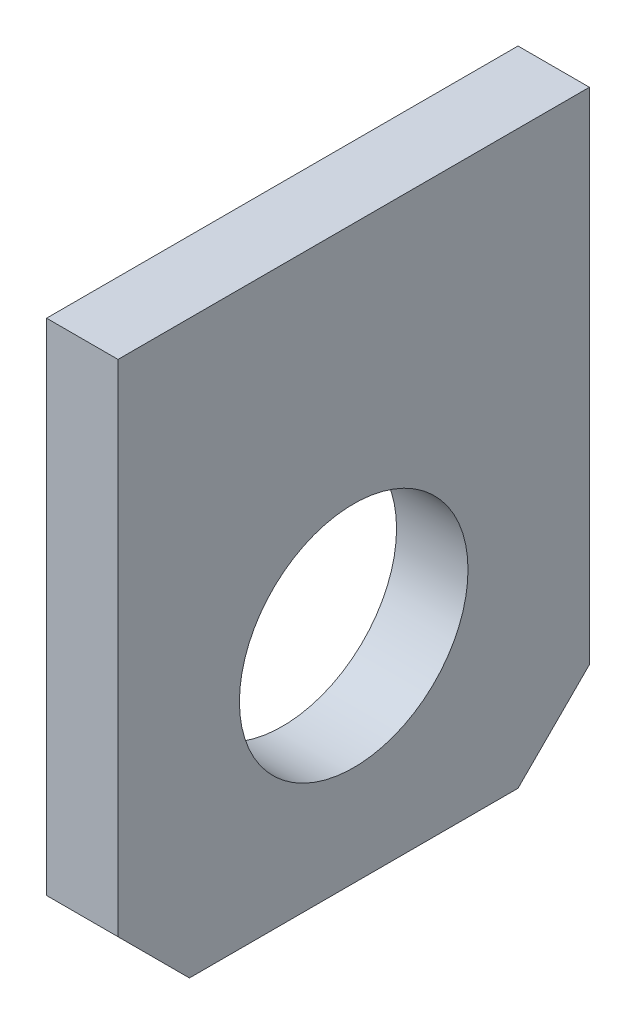
ISO-10303-21;
HEADER;
FILE_DESCRIPTION(('STEP AP214'),'2;1');
FILE_NAME('part.step','',(''),(''),'','','');
FILE_SCHEMA(('AUTOMOTIVE_DESIGN { 1 0 10303 214 1 1 1 1 }'));
ENDSEC;
DATA;
#1=APPLICATION_CONTEXT('core data for automotive mechanical design processes');
#2=APPLICATION_PROTOCOL_DEFINITION('international standard','automotive_design',2000,#1);
#3=PRODUCT_CONTEXT('',#1,'mechanical');
#4=PRODUCT('Part','Part','',(#3));
#5=PRODUCT_RELATED_PRODUCT_CATEGORY('part','',(#4));
#6=PRODUCT_DEFINITION_FORMATION('','',#4);
#7=PRODUCT_DEFINITION_CONTEXT('part definition',#1,'design');
#8=PRODUCT_DEFINITION('design','',#6,#7);
#9=PRODUCT_DEFINITION_SHAPE('','',#8);
#10=(LENGTH_UNIT() NAMED_UNIT(*) SI_UNIT(.MILLI.,.METRE.));
#11=(NAMED_UNIT(*) PLANE_ANGLE_UNIT() SI_UNIT($,.RADIAN.));
#12=(NAMED_UNIT(*) SI_UNIT($,.STERADIAN.) SOLID_ANGLE_UNIT());
#13=UNCERTAINTY_MEASURE_WITH_UNIT(LENGTH_MEASURE(1.E-05),#10,'distance_accuracy_value','');
#14=(GEOMETRIC_REPRESENTATION_CONTEXT(3) GLOBAL_UNCERTAINTY_ASSIGNED_CONTEXT((#13)) GLOBAL_UNIT_ASSIGNED_CONTEXT((#10,
#11,#12)) REPRESENTATION_CONTEXT('',''));
#15=CARTESIAN_POINT('',(0.,0.,0.));
#16=DIRECTION('',(0.,0.,1.));
#17=DIRECTION('',(1.,0.,0.));
#18=AXIS2_PLACEMENT_3D('',#15,#16,#17);
#19=CARTESIAN_POINT('',(20.,-2.5,3.25));
#20=DIRECTION('',(-1.,0.,0.));
#21=DIRECTION('',(0.,0.,1.));
#22=AXIS2_PLACEMENT_3D('',#19,#20,#21);
#23=CYLINDRICAL_SURFACE('',#22,0.800000000000001);
#24=CARTESIAN_POINT('',(10.5,-2.5,3.25));
#25=DIRECTION('',(1.,0.,0.));
#26=DIRECTION('',(0.,0.,-1.));
#27=AXIS2_PLACEMENT_3D('',#24,#25,#26);
#28=CIRCLE('',#27,0.800000000000001);
#29=CARTESIAN_POINT('',(10.5,-2.5,2.45));
#30=VERTEX_POINT('',#29);
#31=EDGE_CURVE('E10',#30,#30,#28,.T.);
#32=ORIENTED_EDGE('',*,*,#31,.F.);
#33=EDGE_LOOP('',(#32));
#34=FACE_BOUND('',#33,.T.);
#35=CARTESIAN_POINT('',(11.,-2.5,3.25));
#36=DIRECTION('',(-1.,0.,0.));
#37=DIRECTION('',(0.,0.,1.));
#38=AXIS2_PLACEMENT_3D('',#35,#36,#37);
#39=CIRCLE('',#38,0.800000000000001);
#40=CARTESIAN_POINT('',(11.,-2.5,4.05));
#41=VERTEX_POINT('',#40);
#42=EDGE_CURVE('E108',#41,#41,#39,.T.);
#43=ORIENTED_EDGE('',*,*,#42,.F.);
#44=EDGE_LOOP('',(#43));
#45=FACE_BOUND('',#44,.T.);
#46=ADVANCED_FACE('F15',(#34,#45),#23,.F.);
#47=CARTESIAN_POINT('',(10.5,-4.,4.9));
#48=DIRECTION('',(1.,0.,0.));
#49=DIRECTION('',(0.,0.,-1.));
#50=AXIS2_PLACEMENT_3D('',#47,#48,#49);
#51=PLANE('',#50);
#52=ORIENTED_EDGE('',*,*,#31,.T.);
#53=EDGE_LOOP('',(#52));
#54=FACE_BOUND('',#53,.T.);
#55=DIRECTION('',(0.,1.,0.));
#56=VECTOR('',#55,1.);
#57=CARTESIAN_POINT('',(10.5,-4.,1.6));
#58=LINE('',#57,#56);
#59=CARTESIAN_POINT('',(10.5,-3.5,1.6));
#60=VERTEX_POINT('',#59);
#61=CARTESIAN_POINT('',(10.5,0.,1.6));
#62=VERTEX_POINT('',#61);
#63=EDGE_CURVE('E34',#60,#62,#58,.T.);
#64=ORIENTED_EDGE('',*,*,#63,.F.);
#65=DIRECTION('',(0.,-0.707106781186548,0.707106781186547));
#66=VECTOR('',#65,1.);
#67=CARTESIAN_POINT('',(10.5,-5.4,3.5));
#68=LINE('',#67,#66);
#69=CARTESIAN_POINT('',(10.5,-4.,2.1));
#70=VERTEX_POINT('',#69);
#71=EDGE_CURVE('E25',#60,#70,#68,.T.);
#72=ORIENTED_EDGE('',*,*,#71,.T.);
#73=DIRECTION('',(0.,0.,-1.));
#74=VECTOR('',#73,1.);
#75=CARTESIAN_POINT('',(10.5,-4.,4.9));
#76=LINE('',#75,#74);
#77=CARTESIAN_POINT('',(10.5,-4.,4.4));
#78=VERTEX_POINT('',#77);
#79=EDGE_CURVE('E93',#78,#70,#76,.T.);
#80=ORIENTED_EDGE('',*,*,#79,.F.);
#81=DIRECTION('',(0.,0.707106781186547,0.707106781186548));
#82=VECTOR('',#81,1.);
#83=CARTESIAN_POINT('',(10.5,-3.75,4.65));
#84=LINE('',#83,#82);
#85=CARTESIAN_POINT('',(10.5,-3.5,4.9));
#86=VERTEX_POINT('',#85);
#87=EDGE_CURVE('E122',#78,#86,#84,.T.);
#88=ORIENTED_EDGE('',*,*,#87,.T.);
#89=DIRECTION('',(0.,1.,0.));
#90=VECTOR('',#89,1.);
#91=CARTESIAN_POINT('',(10.5,-4.,4.9));
#92=LINE('',#91,#90);
#93=CARTESIAN_POINT('',(10.5,0.,4.9));
#94=VERTEX_POINT('',#93);
#95=EDGE_CURVE('E89',#86,#94,#92,.T.);
#96=ORIENTED_EDGE('',*,*,#95,.T.);
#97=DIRECTION('',(0.,0.,-1.));
#98=VECTOR('',#97,1.);
#99=CARTESIAN_POINT('',(10.5,0.,4.9));
#100=LINE('',#99,#98);
#101=EDGE_CURVE('E113',#94,#62,#100,.T.);
#102=ORIENTED_EDGE('',*,*,#101,.T.);
#103=EDGE_LOOP('',(#64,#72,#80,#88,#96,#102));
#104=FACE_BOUND('',#103,.T.);
#105=ADVANCED_FACE('F124',(#54,#104),#51,.F.);
#106=CARTESIAN_POINT('',(10.5,-4.,1.6));
#107=DIRECTION('',(0.,0.,1.));
#108=DIRECTION('',(1.,0.,0.));
#109=AXIS2_PLACEMENT_3D('',#106,#107,#108);
#110=PLANE('',#109);
#111=DIRECTION('',(0.,1.,0.));
#112=VECTOR('',#111,1.);
#113=CARTESIAN_POINT('',(11.,-4.,1.6));
#114=LINE('',#113,#112);
#115=CARTESIAN_POINT('',(11.,-3.5,1.6));
#116=VERTEX_POINT('',#115);
#117=CARTESIAN_POINT('',(11.,0.,1.6));
#118=VERTEX_POINT('',#117);
#119=EDGE_CURVE('E109',#116,#118,#114,.T.);
#120=ORIENTED_EDGE('',*,*,#119,.F.);
#121=DIRECTION('',(-1.,0.,0.));
#122=VECTOR('',#121,1.);
#123=CARTESIAN_POINT('',(20.,-3.5,1.6));
#124=LINE('',#123,#122);
#125=EDGE_CURVE('E115',#116,#60,#124,.T.);
#126=ORIENTED_EDGE('',*,*,#125,.T.);
#127=ORIENTED_EDGE('',*,*,#63,.T.);
#128=DIRECTION('',(1.,0.,0.));
#129=VECTOR('',#128,1.);
#130=CARTESIAN_POINT('',(10.5,0.,1.6));
#131=LINE('',#130,#129);
#132=EDGE_CURVE('E103',#62,#118,#131,.T.);
#133=ORIENTED_EDGE('',*,*,#132,.T.);
#134=EDGE_LOOP('',(#120,#126,#127,#133));
#135=FACE_BOUND('',#134,.T.);
#136=ADVANCED_FACE('F141',(#135),#110,.F.);
#137=CARTESIAN_POINT('',(11.,-4.,4.9));
#138=DIRECTION('',(-1.,0.,0.));
#139=DIRECTION('',(0.,0.,1.));
#140=AXIS2_PLACEMENT_3D('',#137,#138,#139);
#141=PLANE('',#140);
#142=ORIENTED_EDGE('',*,*,#42,.T.);
#143=EDGE_LOOP('',(#142));
#144=FACE_BOUND('',#143,.T.);
#145=DIRECTION('',(0.,0.,1.));
#146=VECTOR('',#145,1.);
#147=CARTESIAN_POINT('',(11.,-4.,4.9));
#148=LINE('',#147,#146);
#149=CARTESIAN_POINT('',(11.,-4.,2.1));
#150=VERTEX_POINT('',#149);
#151=CARTESIAN_POINT('',(11.,-4.,4.4));
#152=VERTEX_POINT('',#151);
#153=EDGE_CURVE('E96',#150,#152,#148,.T.);
#154=ORIENTED_EDGE('',*,*,#153,.F.);
#155=DIRECTION('',(0.,0.707106781186548,-0.707106781186547));
#156=VECTOR('',#155,1.);
#157=CARTESIAN_POINT('',(11.,-5.4,3.5));
#158=LINE('',#157,#156);
#159=EDGE_CURVE('E105',#150,#116,#158,.T.);
#160=ORIENTED_EDGE('',*,*,#159,.T.);
#161=ORIENTED_EDGE('',*,*,#119,.T.);
#162=DIRECTION('',(0.,0.,1.));
#163=VECTOR('',#162,1.);
#164=CARTESIAN_POINT('',(11.,0.,4.9));
#165=LINE('',#164,#163);
#166=CARTESIAN_POINT('',(11.,0.,4.9));
#167=VERTEX_POINT('',#166);
#168=EDGE_CURVE('E76',#118,#167,#165,.T.);
#169=ORIENTED_EDGE('',*,*,#168,.T.);
#170=DIRECTION('',(0.,1.,0.));
#171=VECTOR('',#170,1.);
#172=CARTESIAN_POINT('',(11.,-4.,4.9));
#173=LINE('',#172,#171);
#174=CARTESIAN_POINT('',(11.,-3.5,4.9));
#175=VERTEX_POINT('',#174);
#176=EDGE_CURVE('E67',#175,#167,#173,.T.);
#177=ORIENTED_EDGE('',*,*,#176,.F.);
#178=DIRECTION('',(0.,-0.707106781186547,-0.707106781186548));
#179=VECTOR('',#178,1.);
#180=CARTESIAN_POINT('',(11.,-3.75,4.65));
#181=LINE('',#180,#179);
#182=EDGE_CURVE('E73',#175,#152,#181,.T.);
#183=ORIENTED_EDGE('',*,*,#182,.T.);
#184=EDGE_LOOP('',(#154,#160,#161,#169,#177,#183));
#185=FACE_BOUND('',#184,.T.);
#186=ADVANCED_FACE('F72',(#144,#185),#141,.F.);
#187=CARTESIAN_POINT('',(10.5,-4.,4.9));
#188=DIRECTION('',(0.,0.,-1.));
#189=DIRECTION('',(-1.,0.,0.));
#190=AXIS2_PLACEMENT_3D('',#187,#188,#189);
#191=PLANE('',#190);
#192=ORIENTED_EDGE('',*,*,#95,.F.);
#193=DIRECTION('',(-1.,0.,0.));
#194=VECTOR('',#193,1.);
#195=CARTESIAN_POINT('',(20.,-3.5,4.9));
#196=LINE('',#195,#194);
#197=EDGE_CURVE('E84',#175,#86,#196,.T.);
#198=ORIENTED_EDGE('',*,*,#197,.F.);
#199=ORIENTED_EDGE('',*,*,#176,.T.);
#200=DIRECTION('',(-1.,0.,0.));
#201=VECTOR('',#200,1.);
#202=CARTESIAN_POINT('',(10.5,0.,4.9));
#203=LINE('',#202,#201);
#204=EDGE_CURVE('E78',#167,#94,#203,.T.);
#205=ORIENTED_EDGE('',*,*,#204,.T.);
#206=EDGE_LOOP('',(#192,#198,#199,#205));
#207=FACE_BOUND('',#206,.T.);
#208=ADVANCED_FACE('F87',(#207),#191,.F.);
#209=CARTESIAN_POINT('',(0.,-4.,0.));
#210=DIRECTION('',(0.,-1.,0.));
#211=DIRECTION('',(0.,0.,-1.));
#212=AXIS2_PLACEMENT_3D('',#209,#210,#211);
#213=PLANE('',#212);
#214=DIRECTION('',(-1.,0.,0.));
#215=VECTOR('',#214,1.);
#216=CARTESIAN_POINT('',(0.,-4.,2.1));
#217=LINE('',#216,#215);
#218=EDGE_CURVE('E91',#150,#70,#217,.T.);
#219=ORIENTED_EDGE('',*,*,#218,.F.);
#220=ORIENTED_EDGE('',*,*,#153,.T.);
#221=DIRECTION('',(1.,0.,0.));
#222=VECTOR('',#221,1.);
#223=CARTESIAN_POINT('',(0.,-4.,4.4));
#224=LINE('',#223,#222);
#225=EDGE_CURVE('E19',#78,#152,#224,.T.);
#226=ORIENTED_EDGE('',*,*,#225,.F.);
#227=ORIENTED_EDGE('',*,*,#79,.T.);
#228=EDGE_LOOP('',(#219,#220,#226,#227));
#229=FACE_BOUND('',#228,.T.);
#230=ADVANCED_FACE('F126',(#229),#213,.T.);
#231=CARTESIAN_POINT('',(0.,0.,0.));
#232=DIRECTION('',(0.,-1.,0.));
#233=DIRECTION('',(0.,0.,-1.));
#234=AXIS2_PLACEMENT_3D('',#231,#232,#233);
#235=PLANE('',#234);
#236=ORIENTED_EDGE('',*,*,#101,.F.);
#237=ORIENTED_EDGE('',*,*,#204,.F.);
#238=ORIENTED_EDGE('',*,*,#168,.F.);
#239=ORIENTED_EDGE('',*,*,#132,.F.);
#240=EDGE_LOOP('',(#236,#237,#238,#239));
#241=FACE_BOUND('',#240,.T.);
#242=ADVANCED_FACE('F134',(#241),#235,.F.);
#243=CARTESIAN_POINT('',(20.,-3.5,4.9));
#244=DIRECTION('',(0.,0.707106781186548,-0.707106781186547));
#245=DIRECTION('',(0.,0.707106781186547,0.707106781186548));
#246=AXIS2_PLACEMENT_3D('',#243,#244,#245);
#247=PLANE('',#246);
#248=ORIENTED_EDGE('',*,*,#225,.T.);
#249=ORIENTED_EDGE('',*,*,#182,.F.);
#250=ORIENTED_EDGE('',*,*,#197,.T.);
#251=ORIENTED_EDGE('',*,*,#87,.F.);
#252=EDGE_LOOP('',(#248,#249,#250,#251));
#253=FACE_BOUND('',#252,.T.);
#254=ADVANCED_FACE('F82',(#253),#247,.F.);
#255=CARTESIAN_POINT('',(20.,-3.5,1.6));
#256=DIRECTION('',(0.,0.707106781186547,0.707106781186548));
#257=DIRECTION('',(0.,-0.707106781186548,0.707106781186547));
#258=AXIS2_PLACEMENT_3D('',#255,#256,#257);
#259=PLANE('',#258);
#260=ORIENTED_EDGE('',*,*,#125,.F.);
#261=ORIENTED_EDGE('',*,*,#159,.F.);
#262=ORIENTED_EDGE('',*,*,#218,.T.);
#263=ORIENTED_EDGE('',*,*,#71,.F.);
#264=EDGE_LOOP('',(#260,#261,#262,#263));
#265=FACE_BOUND('',#264,.T.);
#266=ADVANCED_FACE('F17',(#265),#259,.F.);
#267=CLOSED_SHELL('',(#46,#105,#136,#186,#208,#230,#242,#254,#266));
#268=MANIFOLD_SOLID_BREP('B1',#267);
#269=ADVANCED_BREP_SHAPE_REPRESENTATION('',(#18,#268),#14);
#270=SHAPE_DEFINITION_REPRESENTATION(#9,#269);
ENDSEC;
END-ISO-10303-21;
